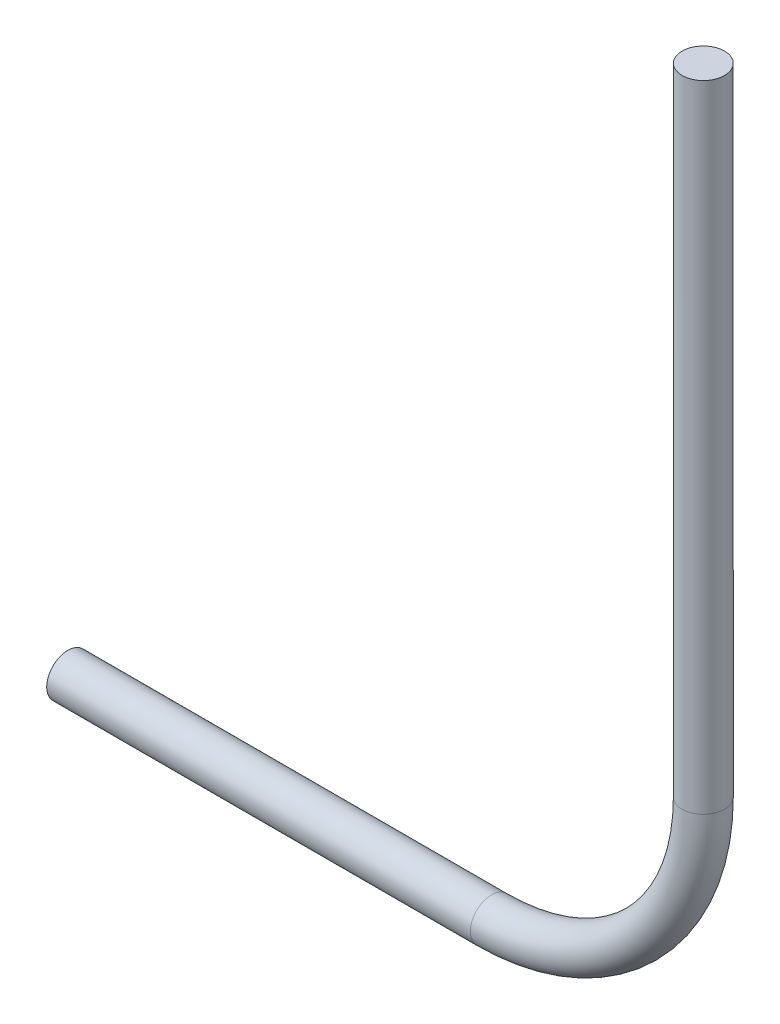
ISO-10303-21;
HEADER;
FILE_DESCRIPTION(('STEP AP214'),'2;1');
FILE_NAME('part.step','',(''),(''),'','','');
FILE_SCHEMA(('AUTOMOTIVE_DESIGN { 1 0 10303 214 1 1 1 1 }'));
ENDSEC;
DATA;
#1=APPLICATION_CONTEXT('core data for automotive mechanical design processes');
#2=APPLICATION_PROTOCOL_DEFINITION('international standard','automotive_design',2000,#1);
#3=PRODUCT_CONTEXT('',#1,'mechanical');
#4=PRODUCT('Part','Part','',(#3));
#5=PRODUCT_RELATED_PRODUCT_CATEGORY('part','',(#4));
#6=PRODUCT_DEFINITION_FORMATION('','',#4);
#7=PRODUCT_DEFINITION_CONTEXT('part definition',#1,'design');
#8=PRODUCT_DEFINITION('design','',#6,#7);
#9=PRODUCT_DEFINITION_SHAPE('','',#8);
#10=(LENGTH_UNIT() NAMED_UNIT(*) SI_UNIT(.MILLI.,.METRE.));
#11=(NAMED_UNIT(*) PLANE_ANGLE_UNIT() SI_UNIT($,.RADIAN.));
#12=(NAMED_UNIT(*) SI_UNIT($,.STERADIAN.) SOLID_ANGLE_UNIT());
#13=UNCERTAINTY_MEASURE_WITH_UNIT(LENGTH_MEASURE(1.E-05),#10,'distance_accuracy_value','');
#14=(GEOMETRIC_REPRESENTATION_CONTEXT(3) GLOBAL_UNCERTAINTY_ASSIGNED_CONTEXT((#13)) GLOBAL_UNIT_ASSIGNED_CONTEXT((#10,
#11,#12)) REPRESENTATION_CONTEXT('',''));
#15=CARTESIAN_POINT('',(0.,0.,0.));
#16=DIRECTION('',(0.,0.,1.));
#17=DIRECTION('',(1.,0.,0.));
#18=AXIS2_PLACEMENT_3D('',#15,#16,#17);
#19=CARTESIAN_POINT('',(0.,0.,0.));
#20=DIRECTION('',(1.,0.,0.));
#21=DIRECTION('',(0.,0.,-1.));
#22=AXIS2_PLACEMENT_3D('',#19,#20,#21);
#23=PLANE('',#22);
#24=CARTESIAN_POINT('',(0.,0.,0.));
#25=DIRECTION('',(1.,0.,0.));
#26=DIRECTION('',(0.,0.,-1.));
#27=AXIS2_PLACEMENT_3D('',#24,#25,#26);
#28=CIRCLE('',#27,1.);
#29=CARTESIAN_POINT('',(0.,0.,-1.));
#30=VERTEX_POINT('',#29);
#31=EDGE_CURVE('E54',#30,#30,#28,.T.);
#32=ORIENTED_EDGE('',*,*,#31,.F.);
#33=EDGE_LOOP('',(#32));
#34=FACE_BOUND('',#33,.T.);
#35=ADVANCED_FACE('F37',(#34),#23,.F.);
#36=CARTESIAN_POINT('',(30.,40.,0.));
#37=DIRECTION('',(0.,1.,0.));
#38=DIRECTION('',(0.,0.,-1.));
#39=AXIS2_PLACEMENT_3D('',#36,#37,#38);
#40=PLANE('',#39);
#41=CARTESIAN_POINT('',(30.,40.,0.));
#42=DIRECTION('',(0.,1.,0.));
#43=DIRECTION('',(0.,0.,-1.));
#44=AXIS2_PLACEMENT_3D('',#41,#42,#43);
#45=CIRCLE('',#44,1.);
#46=CARTESIAN_POINT('',(30.,40.,-1.));
#47=VERTEX_POINT('',#46);
#48=EDGE_CURVE('E10',#47,#47,#45,.T.);
#49=ORIENTED_EDGE('',*,*,#48,.T.);
#50=EDGE_LOOP('',(#49));
#51=FACE_BOUND('',#50,.T.);
#52=ADVANCED_FACE('F64',(#51),#40,.T.);
#53=CARTESIAN_POINT('',(0.,0.,0.));
#54=DIRECTION('',(1.,0.,0.));
#55=DIRECTION('',(0.,0.,-1.));
#56=AXIS2_PLACEMENT_3D('',#53,#54,#55);
#57=CYLINDRICAL_SURFACE('',#56,1.);
#58=CARTESIAN_POINT('',(19.9999999999999,0.,0.));
#59=DIRECTION('',(1.,0.,0.));
#60=DIRECTION('',(0.,0.,-1.));
#61=AXIS2_PLACEMENT_3D('',#58,#59,#60);
#62=CIRCLE('',#61,1.);
#63=CARTESIAN_POINT('',(19.9999999999999,-0.999999999999999,0.));
#64=VERTEX_POINT('',#63);
#65=EDGE_CURVE('E49',#64,#64,#62,.T.);
#66=ORIENTED_EDGE('',*,*,#65,.F.);
#67=EDGE_LOOP('',(#66));
#68=FACE_BOUND('',#67,.T.);
#69=ORIENTED_EDGE('',*,*,#31,.T.);
#70=EDGE_LOOP('',(#69));
#71=FACE_BOUND('',#70,.T.);
#72=ADVANCED_FACE('F61',(#68,#71),#57,.T.);
#73=CARTESIAN_POINT('',(20.,10.,0.));
#74=DIRECTION('',(0.,0.,1.));
#75=DIRECTION('',(1.,0.,0.));
#76=AXIS2_PLACEMENT_3D('',#73,#74,#75);
#77=TOROIDAL_SURFACE('',#76,10.,1.);
#78=CARTESIAN_POINT('',(30.,10.,0.));
#79=DIRECTION('',(0.,1.,0.));
#80=DIRECTION('',(0.,0.,-1.));
#81=AXIS2_PLACEMENT_3D('',#78,#79,#80);
#82=CIRCLE('',#81,1.);
#83=CARTESIAN_POINT('',(31.,10.,0.));
#84=VERTEX_POINT('',#83);
#85=EDGE_CURVE('E44',#84,#84,#82,.T.);
#86=CARTESIAN_POINT('',(20.,10.,0.));
#87=DIRECTION('',(0.,0.,1.));
#88=DIRECTION('',(1.,0.,0.));
#89=AXIS2_PLACEMENT_3D('',#86,#87,#88);
#90=CIRCLE('',#89,11.);
#91=EDGE_CURVE('',#64,#84,#90,.T.);
#92=ORIENTED_EDGE('',*,*,#65,.T.);
#93=ORIENTED_EDGE('',*,*,#85,.F.);
#94=ORIENTED_EDGE('',*,*,#91,.T.);
#95=ORIENTED_EDGE('',*,*,#91,.F.);
#96=EDGE_LOOP('',(#92,#94,#93,#95));
#97=FACE_BOUND('',#96,.T.);
#98=ADVANCED_FACE('F70',(#97),#77,.T.);
#99=CARTESIAN_POINT('',(30.,10.,0.));
#100=DIRECTION('',(0.,1.,0.));
#101=DIRECTION('',(0.,0.,1.));
#102=AXIS2_PLACEMENT_3D('',#99,#100,#101);
#103=CYLINDRICAL_SURFACE('',#102,1.);
#104=ORIENTED_EDGE('',*,*,#48,.F.);
#105=EDGE_LOOP('',(#104));
#106=FACE_BOUND('',#105,.T.);
#107=ORIENTED_EDGE('',*,*,#85,.T.);
#108=EDGE_LOOP('',(#107));
#109=FACE_BOUND('',#108,.T.);
#110=ADVANCED_FACE('F68',(#106,#109),#103,.T.);
#111=CLOSED_SHELL('',(#35,#52,#72,#98,#110));
#112=MANIFOLD_SOLID_BREP('B2',#111);
#113=ADVANCED_BREP_SHAPE_REPRESENTATION('',(#18,#112),#14);
#114=SHAPE_DEFINITION_REPRESENTATION(#9,#113);
ENDSEC;
END-ISO-10303-21;
